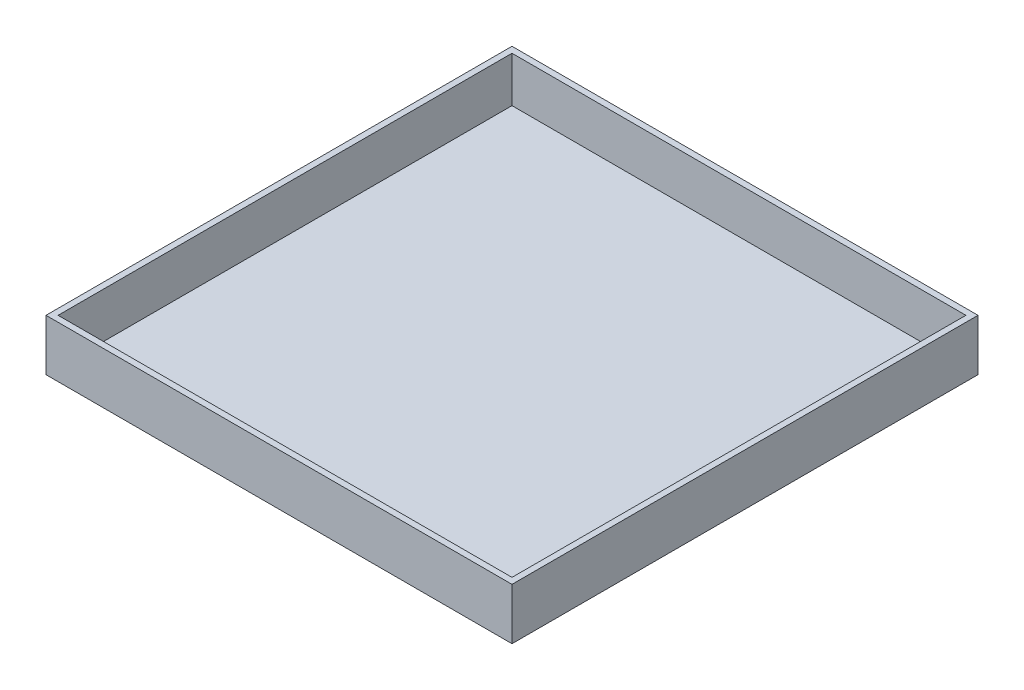
ISO-10303-21;
HEADER;
FILE_DESCRIPTION(('STEP AP214'),'2;1');
FILE_NAME('part.step','',(''),(''),'','','');
FILE_SCHEMA(('AUTOMOTIVE_DESIGN { 1 0 10303 214 1 1 1 1 }'));
ENDSEC;
DATA;
#1=APPLICATION_CONTEXT('core data for automotive mechanical design processes');
#2=APPLICATION_PROTOCOL_DEFINITION('international standard','automotive_design',2000,#1);
#3=PRODUCT_CONTEXT('',#1,'mechanical');
#4=PRODUCT('Part','Part','',(#3));
#5=PRODUCT_RELATED_PRODUCT_CATEGORY('part','',(#4));
#6=PRODUCT_DEFINITION_FORMATION('','',#4);
#7=PRODUCT_DEFINITION_CONTEXT('part definition',#1,'design');
#8=PRODUCT_DEFINITION('design','',#6,#7);
#9=PRODUCT_DEFINITION_SHAPE('','',#8);
#10=(LENGTH_UNIT() NAMED_UNIT(*) SI_UNIT(.MILLI.,.METRE.));
#11=(NAMED_UNIT(*) PLANE_ANGLE_UNIT() SI_UNIT($,.RADIAN.));
#12=(NAMED_UNIT(*) SI_UNIT($,.STERADIAN.) SOLID_ANGLE_UNIT());
#13=UNCERTAINTY_MEASURE_WITH_UNIT(LENGTH_MEASURE(1.E-05),#10,'distance_accuracy_value','');
#14=(GEOMETRIC_REPRESENTATION_CONTEXT(3) GLOBAL_UNCERTAINTY_ASSIGNED_CONTEXT((#13)) GLOBAL_UNIT_ASSIGNED_CONTEXT((#10,
#11,#12)) REPRESENTATION_CONTEXT('',''));
#15=CARTESIAN_POINT('',(0.,0.,0.));
#16=DIRECTION('',(0.,0.,1.));
#17=DIRECTION('',(1.,0.,0.));
#18=AXIS2_PLACEMENT_3D('',#15,#16,#17);
#19=CARTESIAN_POINT('',(-77.,0.,77.));
#20=DIRECTION('',(-1.,0.,0.));
#21=DIRECTION('',(0.,0.,1.));
#22=AXIS2_PLACEMENT_3D('',#19,#20,#21);
#23=PLANE('',#22);
#24=DIRECTION('',(0.,1.,0.));
#25=VECTOR('',#24,1.);
#26=CARTESIAN_POINT('',(-77.,0.,77.));
#27=LINE('',#26,#25);
#28=CARTESIAN_POINT('',(-77.,0.,77.));
#29=VERTEX_POINT('',#28);
#30=CARTESIAN_POINT('',(-77.,17.,77.));
#31=VERTEX_POINT('',#30);
#32=EDGE_CURVE('E37',#29,#31,#27,.T.);
#33=ORIENTED_EDGE('',*,*,#32,.T.);
#34=DIRECTION('',(0.,0.,1.));
#35=VECTOR('',#34,1.);
#36=CARTESIAN_POINT('',(-77.,17.,77.));
#37=LINE('',#36,#35);
#38=CARTESIAN_POINT('',(-77.,17.,-77.));
#39=VERTEX_POINT('',#38);
#40=EDGE_CURVE('E140',#39,#31,#37,.T.);
#41=ORIENTED_EDGE('',*,*,#40,.F.);
#42=DIRECTION('',(0.,1.,0.));
#43=VECTOR('',#42,1.);
#44=CARTESIAN_POINT('',(-77.,0.,-77.));
#45=LINE('',#44,#43);
#46=CARTESIAN_POINT('',(-77.,0.,-77.));
#47=VERTEX_POINT('',#46);
#48=EDGE_CURVE('E11',#47,#39,#45,.T.);
#49=ORIENTED_EDGE('',*,*,#48,.F.);
#50=DIRECTION('',(0.,0.,1.));
#51=VECTOR('',#50,1.);
#52=CARTESIAN_POINT('',(-77.,0.,77.));
#53=LINE('',#52,#51);
#54=EDGE_CURVE('E146',#47,#29,#53,.T.);
#55=ORIENTED_EDGE('',*,*,#54,.T.);
#56=EDGE_LOOP('',(#33,#41,#49,#55));
#57=FACE_BOUND('',#56,.T.);
#58=ADVANCED_FACE('F33',(#57),#23,.T.);
#59=CARTESIAN_POINT('',(77.,0.,-77.));
#60=DIRECTION('',(0.,0.,-1.));
#61=DIRECTION('',(-1.,0.,0.));
#62=AXIS2_PLACEMENT_3D('',#59,#60,#61);
#63=PLANE('',#62);
#64=ORIENTED_EDGE('',*,*,#48,.T.);
#65=DIRECTION('',(-1.,0.,0.));
#66=VECTOR('',#65,1.);
#67=CARTESIAN_POINT('',(-77.,17.,-77.));
#68=LINE('',#67,#66);
#69=CARTESIAN_POINT('',(77.,17.,-77.));
#70=VERTEX_POINT('',#69);
#71=EDGE_CURVE('E137',#70,#39,#68,.T.);
#72=ORIENTED_EDGE('',*,*,#71,.F.);
#73=DIRECTION('',(0.,1.,0.));
#74=VECTOR('',#73,1.);
#75=CARTESIAN_POINT('',(77.,0.,-77.));
#76=LINE('',#75,#74);
#77=CARTESIAN_POINT('',(77.,0.,-77.));
#78=VERTEX_POINT('',#77);
#79=EDGE_CURVE('E42',#78,#70,#76,.T.);
#80=ORIENTED_EDGE('',*,*,#79,.F.);
#81=DIRECTION('',(-1.,0.,0.));
#82=VECTOR('',#81,1.);
#83=CARTESIAN_POINT('',(77.,0.,-77.));
#84=LINE('',#83,#82);
#85=EDGE_CURVE('E155',#78,#47,#84,.T.);
#86=ORIENTED_EDGE('',*,*,#85,.T.);
#87=EDGE_LOOP('',(#64,#72,#80,#86));
#88=FACE_BOUND('',#87,.T.);
#89=ADVANCED_FACE('F177',(#88),#63,.T.);
#90=CARTESIAN_POINT('',(77.,0.,77.));
#91=DIRECTION('',(1.,0.,0.));
#92=DIRECTION('',(0.,0.,-1.));
#93=AXIS2_PLACEMENT_3D('',#90,#91,#92);
#94=PLANE('',#93);
#95=ORIENTED_EDGE('',*,*,#79,.T.);
#96=DIRECTION('',(0.,0.,-1.));
#97=VECTOR('',#96,1.);
#98=CARTESIAN_POINT('',(77.,17.,77.));
#99=LINE('',#98,#97);
#100=CARTESIAN_POINT('',(77.,17.,77.));
#101=VERTEX_POINT('',#100);
#102=EDGE_CURVE('E113',#101,#70,#99,.T.);
#103=ORIENTED_EDGE('',*,*,#102,.F.);
#104=DIRECTION('',(0.,1.,0.));
#105=VECTOR('',#104,1.);
#106=CARTESIAN_POINT('',(77.,0.,77.));
#107=LINE('',#106,#105);
#108=CARTESIAN_POINT('',(77.,0.,77.));
#109=VERTEX_POINT('',#108);
#110=EDGE_CURVE('E158',#109,#101,#107,.T.);
#111=ORIENTED_EDGE('',*,*,#110,.F.);
#112=DIRECTION('',(0.,0.,-1.));
#113=VECTOR('',#112,1.);
#114=CARTESIAN_POINT('',(77.,0.,77.));
#115=LINE('',#114,#113);
#116=EDGE_CURVE('E152',#109,#78,#115,.T.);
#117=ORIENTED_EDGE('',*,*,#116,.T.);
#118=EDGE_LOOP('',(#95,#103,#111,#117));
#119=FACE_BOUND('',#118,.T.);
#120=ADVANCED_FACE('F170',(#119),#94,.T.);
#121=CARTESIAN_POINT('',(77.,0.,77.));
#122=DIRECTION('',(0.,0.,1.));
#123=DIRECTION('',(1.,0.,0.));
#124=AXIS2_PLACEMENT_3D('',#121,#122,#123);
#125=PLANE('',#124);
#126=ORIENTED_EDGE('',*,*,#110,.T.);
#127=DIRECTION('',(1.,0.,0.));
#128=VECTOR('',#127,1.);
#129=CARTESIAN_POINT('',(-77.,17.,77.));
#130=LINE('',#129,#128);
#131=EDGE_CURVE('E143',#31,#101,#130,.T.);
#132=ORIENTED_EDGE('',*,*,#131,.F.);
#133=ORIENTED_EDGE('',*,*,#32,.F.);
#134=DIRECTION('',(1.,0.,0.));
#135=VECTOR('',#134,1.);
#136=CARTESIAN_POINT('',(77.,0.,77.));
#137=LINE('',#136,#135);
#138=EDGE_CURVE('E149',#29,#109,#137,.T.);
#139=ORIENTED_EDGE('',*,*,#138,.T.);
#140=EDGE_LOOP('',(#126,#132,#133,#139));
#141=FACE_BOUND('',#140,.T.);
#142=ADVANCED_FACE('F168',(#141),#125,.T.);
#143=CARTESIAN_POINT('',(0.,0.,0.));
#144=DIRECTION('',(0.,1.,0.));
#145=DIRECTION('',(0.,0.,1.));
#146=AXIS2_PLACEMENT_3D('',#143,#144,#145);
#147=PLANE('',#146);
#148=ORIENTED_EDGE('',*,*,#54,.F.);
#149=ORIENTED_EDGE('',*,*,#85,.F.);
#150=ORIENTED_EDGE('',*,*,#116,.F.);
#151=ORIENTED_EDGE('',*,*,#138,.F.);
#152=EDGE_LOOP('',(#148,#149,#150,#151));
#153=FACE_BOUND('',#152,.T.);
#154=ADVANCED_FACE('F35',(#153),#147,.F.);
#155=CARTESIAN_POINT('',(0.,17.,0.));
#156=DIRECTION('',(0.,-1.,0.));
#157=DIRECTION('',(0.,0.,-1.));
#158=AXIS2_PLACEMENT_3D('',#155,#156,#157);
#159=PLANE('',#158);
#160=ORIENTED_EDGE('',*,*,#102,.T.);
#161=ORIENTED_EDGE('',*,*,#71,.T.);
#162=ORIENTED_EDGE('',*,*,#40,.T.);
#163=ORIENTED_EDGE('',*,*,#131,.T.);
#164=EDGE_LOOP('',(#160,#161,#162,#163));
#165=FACE_BOUND('',#164,.T.);
#166=DIRECTION('',(0.,0.,-1.));
#167=VECTOR('',#166,1.);
#168=CARTESIAN_POINT('',(75.,17.,74.9999999999997));
#169=LINE('',#168,#167);
#170=CARTESIAN_POINT('',(75.,17.,74.9999999999997));
#171=VERTEX_POINT('',#170);
#172=CARTESIAN_POINT('',(75.,17.,-74.9999999999997));
#173=VERTEX_POINT('',#172);
#174=EDGE_CURVE('E98',#171,#173,#169,.T.);
#175=ORIENTED_EDGE('',*,*,#174,.F.);
#176=DIRECTION('',(1.,0.,0.));
#177=VECTOR('',#176,1.);
#178=CARTESIAN_POINT('',(-75.0000000000001,17.,74.9999999999997));
#179=LINE('',#178,#177);
#180=CARTESIAN_POINT('',(-75.0000000000001,17.,74.9999999999997));
#181=VERTEX_POINT('',#180);
#182=EDGE_CURVE('E121',#181,#171,#179,.T.);
#183=ORIENTED_EDGE('',*,*,#182,.F.);
#184=DIRECTION('',(0.,0.,1.));
#185=VECTOR('',#184,1.);
#186=CARTESIAN_POINT('',(-75.0000000000001,17.,74.9999999999997));
#187=LINE('',#186,#185);
#188=CARTESIAN_POINT('',(-75.0000000000001,17.,-74.9999999999997));
#189=VERTEX_POINT('',#188);
#190=EDGE_CURVE('E119',#189,#181,#187,.T.);
#191=ORIENTED_EDGE('',*,*,#190,.F.);
#192=DIRECTION('',(-1.,0.,0.));
#193=VECTOR('',#192,1.);
#194=CARTESIAN_POINT('',(-75.0000000000001,17.,-74.9999999999997));
#195=LINE('',#194,#193);
#196=EDGE_CURVE('E107',#173,#189,#195,.T.);
#197=ORIENTED_EDGE('',*,*,#196,.F.);
#198=EDGE_LOOP('',(#175,#183,#191,#197));
#199=FACE_BOUND('',#198,.T.);
#200=ADVANCED_FACE('F117',(#165,#199),#159,.F.);
#201=CARTESIAN_POINT('',(75.,17.,74.9999999999997));
#202=DIRECTION('',(-1.,0.,0.));
#203=DIRECTION('',(0.,0.,1.));
#204=AXIS2_PLACEMENT_3D('',#201,#202,#203);
#205=PLANE('',#204);
#206=DIRECTION('',(0.,0.,-1.));
#207=VECTOR('',#206,1.);
#208=CARTESIAN_POINT('',(75.,2.,74.9999999999997));
#209=LINE('',#208,#207);
#210=CARTESIAN_POINT('',(75.,2.,74.9999999999997));
#211=VERTEX_POINT('',#210);
#212=CARTESIAN_POINT('',(75.,2.,-74.9999999999997));
#213=VERTEX_POINT('',#212);
#214=EDGE_CURVE('E50',#211,#213,#209,.T.);
#215=ORIENTED_EDGE('',*,*,#214,.F.);
#216=DIRECTION('',(0.,-1.,0.));
#217=VECTOR('',#216,1.);
#218=CARTESIAN_POINT('',(75.,17.,74.9999999999997));
#219=LINE('',#218,#217);
#220=EDGE_CURVE('E103',#171,#211,#219,.T.);
#221=ORIENTED_EDGE('',*,*,#220,.F.);
#222=ORIENTED_EDGE('',*,*,#174,.T.);
#223=DIRECTION('',(0.,-1.,0.));
#224=VECTOR('',#223,1.);
#225=CARTESIAN_POINT('',(75.,17.,-74.9999999999997));
#226=LINE('',#225,#224);
#227=EDGE_CURVE('E101',#173,#213,#226,.T.);
#228=ORIENTED_EDGE('',*,*,#227,.T.);
#229=EDGE_LOOP('',(#215,#221,#222,#228));
#230=FACE_BOUND('',#229,.T.);
#231=ADVANCED_FACE('F100',(#230),#205,.T.);
#232=CARTESIAN_POINT('',(-75.0000000000001,17.,-74.9999999999997));
#233=DIRECTION('',(0.,0.,1.));
#234=DIRECTION('',(1.,0.,0.));
#235=AXIS2_PLACEMENT_3D('',#232,#233,#234);
#236=PLANE('',#235);
#237=DIRECTION('',(-1.,0.,0.));
#238=VECTOR('',#237,1.);
#239=CARTESIAN_POINT('',(-75.0000000000001,2.,-74.9999999999997));
#240=LINE('',#239,#238);
#241=CARTESIAN_POINT('',(-75.0000000000001,2.,-74.9999999999997));
#242=VERTEX_POINT('',#241);
#243=EDGE_CURVE('E54',#213,#242,#240,.T.);
#244=ORIENTED_EDGE('',*,*,#243,.F.);
#245=ORIENTED_EDGE('',*,*,#227,.F.);
#246=ORIENTED_EDGE('',*,*,#196,.T.);
#247=DIRECTION('',(0.,-1.,0.));
#248=VECTOR('',#247,1.);
#249=CARTESIAN_POINT('',(-75.0000000000001,17.,-74.9999999999997));
#250=LINE('',#249,#248);
#251=EDGE_CURVE('E114',#189,#242,#250,.T.);
#252=ORIENTED_EDGE('',*,*,#251,.T.);
#253=EDGE_LOOP('',(#244,#245,#246,#252));
#254=FACE_BOUND('',#253,.T.);
#255=ADVANCED_FACE('F111',(#254),#236,.T.);
#256=CARTESIAN_POINT('',(-75.0000000000001,17.,74.9999999999997));
#257=DIRECTION('',(1.,0.,0.));
#258=DIRECTION('',(0.,0.,-1.));
#259=AXIS2_PLACEMENT_3D('',#256,#257,#258);
#260=PLANE('',#259);
#261=DIRECTION('',(0.,0.,1.));
#262=VECTOR('',#261,1.);
#263=CARTESIAN_POINT('',(-75.0000000000001,2.,74.9999999999997));
#264=LINE('',#263,#262);
#265=CARTESIAN_POINT('',(-75.0000000000001,2.,74.9999999999997));
#266=VERTEX_POINT('',#265);
#267=EDGE_CURVE('E127',#242,#266,#264,.T.);
#268=ORIENTED_EDGE('',*,*,#267,.F.);
#269=ORIENTED_EDGE('',*,*,#251,.F.);
#270=ORIENTED_EDGE('',*,*,#190,.T.);
#271=DIRECTION('',(0.,-1.,0.));
#272=VECTOR('',#271,1.);
#273=CARTESIAN_POINT('',(-75.0000000000001,17.,74.9999999999997));
#274=LINE('',#273,#272);
#275=EDGE_CURVE('E131',#181,#266,#274,.T.);
#276=ORIENTED_EDGE('',*,*,#275,.T.);
#277=EDGE_LOOP('',(#268,#269,#270,#276));
#278=FACE_BOUND('',#277,.T.);
#279=ADVANCED_FACE('F193',(#278),#260,.T.);
#280=CARTESIAN_POINT('',(-75.0000000000001,17.,74.9999999999997));
#281=DIRECTION('',(0.,0.,-1.));
#282=DIRECTION('',(-1.,0.,0.));
#283=AXIS2_PLACEMENT_3D('',#280,#281,#282);
#284=PLANE('',#283);
#285=DIRECTION('',(1.,0.,0.));
#286=VECTOR('',#285,1.);
#287=CARTESIAN_POINT('',(-75.0000000000001,2.,74.9999999999997));
#288=LINE('',#287,#286);
#289=EDGE_CURVE('E108',#266,#211,#288,.T.);
#290=ORIENTED_EDGE('',*,*,#289,.F.);
#291=ORIENTED_EDGE('',*,*,#275,.F.);
#292=ORIENTED_EDGE('',*,*,#182,.T.);
#293=ORIENTED_EDGE('',*,*,#220,.T.);
#294=EDGE_LOOP('',(#290,#291,#292,#293));
#295=FACE_BOUND('',#294,.T.);
#296=ADVANCED_FACE('F189',(#295),#284,.T.);
#297=CARTESIAN_POINT('',(0.,2.,0.));
#298=DIRECTION('',(0.,1.,0.));
#299=DIRECTION('',(0.,0.,1.));
#300=AXIS2_PLACEMENT_3D('',#297,#298,#299);
#301=PLANE('',#300);
#302=ORIENTED_EDGE('',*,*,#214,.T.);
#303=ORIENTED_EDGE('',*,*,#243,.T.);
#304=ORIENTED_EDGE('',*,*,#267,.T.);
#305=ORIENTED_EDGE('',*,*,#289,.T.);
#306=EDGE_LOOP('',(#302,#303,#304,#305));
#307=FACE_BOUND('',#306,.T.);
#308=ADVANCED_FACE('F187',(#307),#301,.T.);
#309=CLOSED_SHELL('',(#58,#89,#120,#142,#154,#200,#231,#255,#279,#296,#308));
#310=MANIFOLD_SOLID_BREP('B2',#309);
#311=ADVANCED_BREP_SHAPE_REPRESENTATION('',(#18,#310),#14);
#312=SHAPE_DEFINITION_REPRESENTATION(#9,#311);
ENDSEC;
END-ISO-10303-21;
